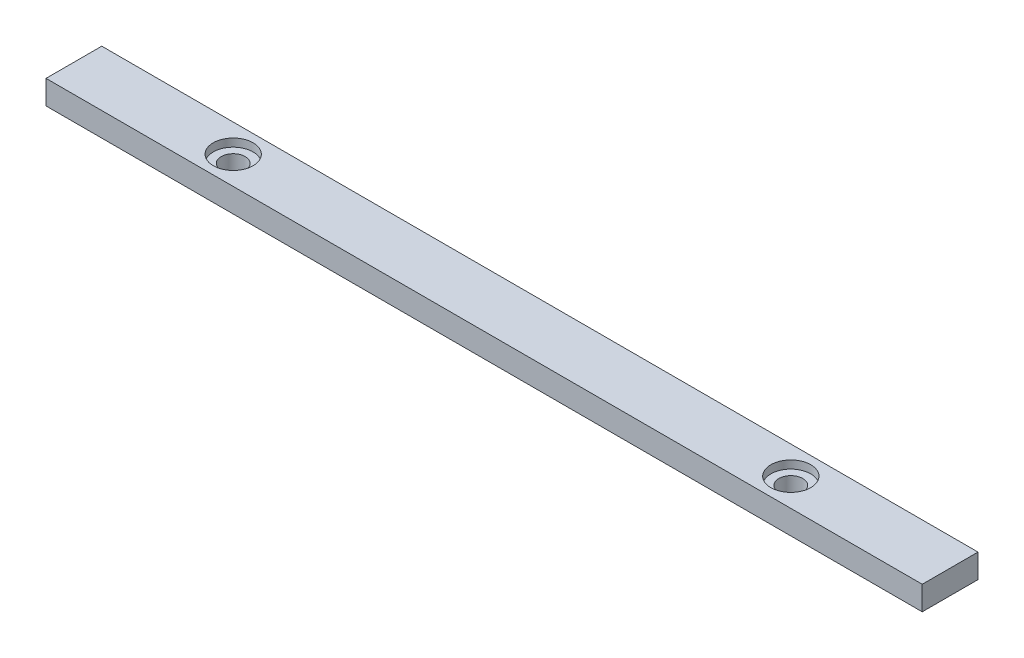
ISO-10303-21;
HEADER;
FILE_DESCRIPTION(('STEP AP214'),'2;1');
FILE_NAME('part.step','',(''),(''),'','','');
FILE_SCHEMA(('AUTOMOTIVE_DESIGN { 1 0 10303 214 1 1 1 1 }'));
ENDSEC;
DATA;
#1=APPLICATION_CONTEXT('core data for automotive mechanical design processes');
#2=APPLICATION_PROTOCOL_DEFINITION('international standard','automotive_design',2000,#1);
#3=PRODUCT_CONTEXT('',#1,'mechanical');
#4=PRODUCT('Part','Part','',(#3));
#5=PRODUCT_RELATED_PRODUCT_CATEGORY('part','',(#4));
#6=PRODUCT_DEFINITION_FORMATION('','',#4);
#7=PRODUCT_DEFINITION_CONTEXT('part definition',#1,'design');
#8=PRODUCT_DEFINITION('design','',#6,#7);
#9=PRODUCT_DEFINITION_SHAPE('','',#8);
#10=(LENGTH_UNIT() NAMED_UNIT(*) SI_UNIT(.MILLI.,.METRE.));
#11=(NAMED_UNIT(*) PLANE_ANGLE_UNIT() SI_UNIT($,.RADIAN.));
#12=(NAMED_UNIT(*) SI_UNIT($,.STERADIAN.) SOLID_ANGLE_UNIT());
#13=UNCERTAINTY_MEASURE_WITH_UNIT(LENGTH_MEASURE(1.E-05),#10,'distance_accuracy_value','');
#14=(GEOMETRIC_REPRESENTATION_CONTEXT(3) GLOBAL_UNCERTAINTY_ASSIGNED_CONTEXT((#13)) GLOBAL_UNIT_ASSIGNED_CONTEXT((#10,
#11,#12)) REPRESENTATION_CONTEXT('',''));
#15=CARTESIAN_POINT('',(0.,0.,0.));
#16=DIRECTION('',(0.,0.,1.));
#17=DIRECTION('',(1.,0.,0.));
#18=AXIS2_PLACEMENT_3D('',#15,#16,#17);
#19=CARTESIAN_POINT('',(20.,3.,-3.5));
#20=DIRECTION('',(0.,-1.,0.));
#21=DIRECTION('',(0.,0.,-1.));
#22=AXIS2_PLACEMENT_3D('',#19,#20,#21);
#23=CYLINDRICAL_SURFACE('',#22,1.5);
#24=CARTESIAN_POINT('',(20.,0.,-3.5));
#25=DIRECTION('',(0.,1.,0.));
#26=DIRECTION('',(0.,0.,1.));
#27=AXIS2_PLACEMENT_3D('',#24,#25,#26);
#28=CIRCLE('',#27,1.5);
#29=CARTESIAN_POINT('',(20.,0.,-2.));
#30=VERTEX_POINT('',#29);
#31=EDGE_CURVE('E103',#30,#30,#28,.T.);
#32=ORIENTED_EDGE('',*,*,#31,.F.);
#33=EDGE_LOOP('',(#32));
#34=FACE_BOUND('',#33,.T.);
#35=CARTESIAN_POINT('',(20.,2.,-3.5));
#36=DIRECTION('',(0.,1.,0.));
#37=DIRECTION('',(0.,0.,1.));
#38=AXIS2_PLACEMENT_3D('',#35,#36,#37);
#39=CIRCLE('',#38,1.5);
#40=CARTESIAN_POINT('',(20.,2.,-2.));
#41=VERTEX_POINT('',#40);
#42=EDGE_CURVE('E37',#41,#41,#39,.T.);
#43=ORIENTED_EDGE('',*,*,#42,.T.);
#44=EDGE_LOOP('',(#43));
#45=FACE_BOUND('',#44,.T.);
#46=ADVANCED_FACE('F33',(#34,#45),#23,.F.);
#47=CARTESIAN_POINT('',(90.,3.,-3.5));
#48=DIRECTION('',(0.,-1.,0.));
#49=DIRECTION('',(0.,0.,-1.));
#50=AXIS2_PLACEMENT_3D('',#47,#48,#49);
#51=CYLINDRICAL_SURFACE('',#50,1.5);
#52=CARTESIAN_POINT('',(90.,0.,-3.5));
#53=DIRECTION('',(0.,1.,0.));
#54=DIRECTION('',(0.,0.,1.));
#55=AXIS2_PLACEMENT_3D('',#52,#53,#54);
#56=CIRCLE('',#55,1.5);
#57=CARTESIAN_POINT('',(90.,0.,-2.));
#58=VERTEX_POINT('',#57);
#59=EDGE_CURVE('E114',#58,#58,#56,.T.);
#60=ORIENTED_EDGE('',*,*,#59,.F.);
#61=EDGE_LOOP('',(#60));
#62=FACE_BOUND('',#61,.T.);
#63=CARTESIAN_POINT('',(90.,2.,-3.5));
#64=DIRECTION('',(0.,1.,0.));
#65=DIRECTION('',(0.,0.,1.));
#66=AXIS2_PLACEMENT_3D('',#63,#64,#65);
#67=CIRCLE('',#66,1.5);
#68=CARTESIAN_POINT('',(90.,2.,-2.));
#69=VERTEX_POINT('',#68);
#70=EDGE_CURVE('E108',#69,#69,#67,.T.);
#71=ORIENTED_EDGE('',*,*,#70,.T.);
#72=EDGE_LOOP('',(#71));
#73=FACE_BOUND('',#72,.T.);
#74=ADVANCED_FACE('F139',(#62,#73),#51,.F.);
#75=CARTESIAN_POINT('',(0.,3.,0.));
#76=DIRECTION('',(0.,-1.,0.));
#77=DIRECTION('',(0.,0.,-1.));
#78=AXIS2_PLACEMENT_3D('',#75,#76,#77);
#79=PLANE('',#78);
#80=CARTESIAN_POINT('',(20.,3.,-3.5));
#81=DIRECTION('',(0.,1.,0.));
#82=DIRECTION('',(0.,0.,1.));
#83=AXIS2_PLACEMENT_3D('',#80,#81,#82);
#84=CIRCLE('',#83,2.5);
#85=CARTESIAN_POINT('',(20.,3.,-1.));
#86=VERTEX_POINT('',#85);
#87=EDGE_CURVE('E116',#86,#86,#84,.T.);
#88=ORIENTED_EDGE('',*,*,#87,.F.);
#89=EDGE_LOOP('',(#88));
#90=FACE_BOUND('',#89,.T.);
#91=CARTESIAN_POINT('',(90.,3.,-3.5));
#92=DIRECTION('',(0.,1.,0.));
#93=DIRECTION('',(0.,0.,1.));
#94=AXIS2_PLACEMENT_3D('',#91,#92,#93);
#95=CIRCLE('',#94,2.5);
#96=CARTESIAN_POINT('',(90.,3.,-1.));
#97=VERTEX_POINT('',#96);
#98=EDGE_CURVE('E126',#97,#97,#95,.T.);
#99=ORIENTED_EDGE('',*,*,#98,.F.);
#100=EDGE_LOOP('',(#99));
#101=FACE_BOUND('',#100,.T.);
#102=DIRECTION('',(0.,0.,1.));
#103=VECTOR('',#102,1.);
#104=CARTESIAN_POINT('',(0.,3.,0.));
#105=LINE('',#104,#103);
#106=CARTESIAN_POINT('',(0.,3.,-7.));
#107=VERTEX_POINT('',#106);
#108=CARTESIAN_POINT('',(0.,3.,0.));
#109=VERTEX_POINT('',#108);
#110=EDGE_CURVE('E87',#107,#109,#105,.T.);
#111=ORIENTED_EDGE('',*,*,#110,.T.);
#112=DIRECTION('',(1.,0.,0.));
#113=VECTOR('',#112,1.);
#114=CARTESIAN_POINT('',(0.,3.,0.));
#115=LINE('',#114,#113);
#116=CARTESIAN_POINT('',(110.,3.,0.));
#117=VERTEX_POINT('',#116);
#118=EDGE_CURVE('E82',#109,#117,#115,.T.);
#119=ORIENTED_EDGE('',*,*,#118,.T.);
#120=DIRECTION('',(0.,0.,-1.));
#121=VECTOR('',#120,1.);
#122=CARTESIAN_POINT('',(110.,3.,0.));
#123=LINE('',#122,#121);
#124=CARTESIAN_POINT('',(110.,3.,-7.));
#125=VERTEX_POINT('',#124);
#126=EDGE_CURVE('E85',#117,#125,#123,.T.);
#127=ORIENTED_EDGE('',*,*,#126,.T.);
#128=DIRECTION('',(-1.,0.,0.));
#129=VECTOR('',#128,1.);
#130=CARTESIAN_POINT('',(0.,3.,-7.));
#131=LINE('',#130,#129);
#132=EDGE_CURVE('E52',#125,#107,#131,.T.);
#133=ORIENTED_EDGE('',*,*,#132,.T.);
#134=EDGE_LOOP('',(#111,#119,#127,#133));
#135=FACE_BOUND('',#134,.T.);
#136=ADVANCED_FACE('F83',(#90,#101,#135),#79,.F.);
#137=CARTESIAN_POINT('',(0.,0.,0.));
#138=DIRECTION('',(0.,-1.,0.));
#139=DIRECTION('',(0.,0.,-1.));
#140=AXIS2_PLACEMENT_3D('',#137,#138,#139);
#141=PLANE('',#140);
#142=ORIENTED_EDGE('',*,*,#31,.T.);
#143=EDGE_LOOP('',(#142));
#144=FACE_BOUND('',#143,.T.);
#145=DIRECTION('',(0.,0.,1.));
#146=VECTOR('',#145,1.);
#147=CARTESIAN_POINT('',(0.,0.,0.));
#148=LINE('',#147,#146);
#149=CARTESIAN_POINT('',(0.,0.,-7.));
#150=VERTEX_POINT('',#149);
#151=CARTESIAN_POINT('',(0.,0.,0.));
#152=VERTEX_POINT('',#151);
#153=EDGE_CURVE('E100',#150,#152,#148,.T.);
#154=ORIENTED_EDGE('',*,*,#153,.F.);
#155=DIRECTION('',(-1.,0.,0.));
#156=VECTOR('',#155,1.);
#157=CARTESIAN_POINT('',(0.,0.,-7.));
#158=LINE('',#157,#156);
#159=CARTESIAN_POINT('',(110.,0.,-7.));
#160=VERTEX_POINT('',#159);
#161=EDGE_CURVE('E75',#160,#150,#158,.T.);
#162=ORIENTED_EDGE('',*,*,#161,.F.);
#163=DIRECTION('',(0.,0.,-1.));
#164=VECTOR('',#163,1.);
#165=CARTESIAN_POINT('',(110.,0.,0.));
#166=LINE('',#165,#164);
#167=CARTESIAN_POINT('',(110.,0.,0.));
#168=VERTEX_POINT('',#167);
#169=EDGE_CURVE('E69',#168,#160,#166,.T.);
#170=ORIENTED_EDGE('',*,*,#169,.F.);
#171=DIRECTION('',(1.,0.,0.));
#172=VECTOR('',#171,1.);
#173=CARTESIAN_POINT('',(0.,0.,0.));
#174=LINE('',#173,#172);
#175=EDGE_CURVE('E91',#152,#168,#174,.T.);
#176=ORIENTED_EDGE('',*,*,#175,.F.);
#177=EDGE_LOOP('',(#154,#162,#170,#176));
#178=FACE_BOUND('',#177,.T.);
#179=ORIENTED_EDGE('',*,*,#59,.T.);
#180=EDGE_LOOP('',(#179));
#181=FACE_BOUND('',#180,.T.);
#182=ADVANCED_FACE('F134',(#144,#178,#181),#141,.T.);
#183=CARTESIAN_POINT('',(0.,3.,0.));
#184=DIRECTION('',(1.,0.,0.));
#185=DIRECTION('',(0.,0.,-1.));
#186=AXIS2_PLACEMENT_3D('',#183,#184,#185);
#187=PLANE('',#186);
#188=ORIENTED_EDGE('',*,*,#153,.T.);
#189=DIRECTION('',(0.,-1.,0.));
#190=VECTOR('',#189,1.);
#191=CARTESIAN_POINT('',(0.,3.,0.));
#192=LINE('',#191,#190);
#193=EDGE_CURVE('E11',#109,#152,#192,.T.);
#194=ORIENTED_EDGE('',*,*,#193,.F.);
#195=ORIENTED_EDGE('',*,*,#110,.F.);
#196=DIRECTION('',(0.,-1.,0.));
#197=VECTOR('',#196,1.);
#198=CARTESIAN_POINT('',(0.,3.,-7.));
#199=LINE('',#198,#197);
#200=EDGE_CURVE('E96',#107,#150,#199,.T.);
#201=ORIENTED_EDGE('',*,*,#200,.T.);
#202=EDGE_LOOP('',(#188,#194,#195,#201));
#203=FACE_BOUND('',#202,.T.);
#204=ADVANCED_FACE('F35',(#203),#187,.F.);
#205=CARTESIAN_POINT('',(0.,3.,0.));
#206=DIRECTION('',(0.,0.,-1.));
#207=DIRECTION('',(-1.,0.,0.));
#208=AXIS2_PLACEMENT_3D('',#205,#206,#207);
#209=PLANE('',#208);
#210=ORIENTED_EDGE('',*,*,#175,.T.);
#211=DIRECTION('',(0.,-1.,0.));
#212=VECTOR('',#211,1.);
#213=CARTESIAN_POINT('',(110.,3.,0.));
#214=LINE('',#213,#212);
#215=EDGE_CURVE('E43',#117,#168,#214,.T.);
#216=ORIENTED_EDGE('',*,*,#215,.F.);
#217=ORIENTED_EDGE('',*,*,#118,.F.);
#218=ORIENTED_EDGE('',*,*,#193,.T.);
#219=EDGE_LOOP('',(#210,#216,#217,#218));
#220=FACE_BOUND('',#219,.T.);
#221=ADVANCED_FACE('F90',(#220),#209,.F.);
#222=CARTESIAN_POINT('',(110.,3.,0.));
#223=DIRECTION('',(-1.,0.,0.));
#224=DIRECTION('',(0.,0.,1.));
#225=AXIS2_PLACEMENT_3D('',#222,#223,#224);
#226=PLANE('',#225);
#227=ORIENTED_EDGE('',*,*,#169,.T.);
#228=DIRECTION('',(0.,-1.,0.));
#229=VECTOR('',#228,1.);
#230=CARTESIAN_POINT('',(110.,3.,-7.));
#231=LINE('',#230,#229);
#232=EDGE_CURVE('E92',#125,#160,#231,.T.);
#233=ORIENTED_EDGE('',*,*,#232,.F.);
#234=ORIENTED_EDGE('',*,*,#126,.F.);
#235=ORIENTED_EDGE('',*,*,#215,.T.);
#236=EDGE_LOOP('',(#227,#233,#234,#235));
#237=FACE_BOUND('',#236,.T.);
#238=ADVANCED_FACE('F94',(#237),#226,.F.);
#239=CARTESIAN_POINT('',(0.,3.,-7.));
#240=DIRECTION('',(0.,0.,1.));
#241=DIRECTION('',(1.,0.,0.));
#242=AXIS2_PLACEMENT_3D('',#239,#240,#241);
#243=PLANE('',#242);
#244=ORIENTED_EDGE('',*,*,#161,.T.);
#245=ORIENTED_EDGE('',*,*,#200,.F.);
#246=ORIENTED_EDGE('',*,*,#132,.F.);
#247=ORIENTED_EDGE('',*,*,#232,.T.);
#248=EDGE_LOOP('',(#244,#245,#246,#247));
#249=FACE_BOUND('',#248,.T.);
#250=ADVANCED_FACE('F160',(#249),#243,.F.);
#251=CARTESIAN_POINT('',(90.,2.,-3.5));
#252=DIRECTION('',(0.,1.,0.));
#253=DIRECTION('',(0.,0.,1.));
#254=AXIS2_PLACEMENT_3D('',#251,#252,#253);
#255=CYLINDRICAL_SURFACE('',#254,2.5);
#256=CARTESIAN_POINT('',(90.,2.,-3.5));
#257=DIRECTION('',(0.,1.,0.));
#258=DIRECTION('',(0.,0.,1.));
#259=AXIS2_PLACEMENT_3D('',#256,#257,#258);
#260=CIRCLE('',#259,2.5);
#261=CARTESIAN_POINT('',(90.,2.,-1.));
#262=VERTEX_POINT('',#261);
#263=EDGE_CURVE('E121',#262,#262,#260,.T.);
#264=ORIENTED_EDGE('',*,*,#263,.F.);
#265=EDGE_LOOP('',(#264));
#266=FACE_BOUND('',#265,.T.);
#267=ORIENTED_EDGE('',*,*,#98,.T.);
#268=EDGE_LOOP('',(#267));
#269=FACE_BOUND('',#268,.T.);
#270=ADVANCED_FACE('F156',(#266,#269),#255,.F.);
#271=CARTESIAN_POINT('',(90.,2.,-3.5));
#272=DIRECTION('',(0.,1.,0.));
#273=DIRECTION('',(0.,0.,1.));
#274=AXIS2_PLACEMENT_3D('',#271,#272,#273);
#275=PLANE('',#274);
#276=ORIENTED_EDGE('',*,*,#70,.F.);
#277=EDGE_LOOP('',(#276));
#278=FACE_BOUND('',#277,.T.);
#279=ORIENTED_EDGE('',*,*,#263,.T.);
#280=EDGE_LOOP('',(#279));
#281=FACE_BOUND('',#280,.T.);
#282=ADVANCED_FACE('F150',(#278,#281),#275,.T.);
#283=CARTESIAN_POINT('',(20.,2.,-3.5));
#284=DIRECTION('',(0.,1.,0.));
#285=DIRECTION('',(0.,0.,1.));
#286=AXIS2_PLACEMENT_3D('',#283,#284,#285);
#287=CYLINDRICAL_SURFACE('',#286,2.5);
#288=CARTESIAN_POINT('',(20.,2.,-3.5));
#289=DIRECTION('',(0.,1.,0.));
#290=DIRECTION('',(0.,0.,1.));
#291=AXIS2_PLACEMENT_3D('',#288,#289,#290);
#292=CIRCLE('',#291,2.5);
#293=CARTESIAN_POINT('',(20.,2.,-1.));
#294=VERTEX_POINT('',#293);
#295=EDGE_CURVE('E110',#294,#294,#292,.T.);
#296=ORIENTED_EDGE('',*,*,#295,.F.);
#297=EDGE_LOOP('',(#296));
#298=FACE_BOUND('',#297,.T.);
#299=ORIENTED_EDGE('',*,*,#87,.T.);
#300=EDGE_LOOP('',(#299));
#301=FACE_BOUND('',#300,.T.);
#302=ADVANCED_FACE('F145',(#298,#301),#287,.F.);
#303=CARTESIAN_POINT('',(20.,2.,-3.5));
#304=DIRECTION('',(0.,1.,0.));
#305=DIRECTION('',(0.,0.,1.));
#306=AXIS2_PLACEMENT_3D('',#303,#304,#305);
#307=PLANE('',#306);
#308=ORIENTED_EDGE('',*,*,#42,.F.);
#309=EDGE_LOOP('',(#308));
#310=FACE_BOUND('',#309,.T.);
#311=ORIENTED_EDGE('',*,*,#295,.T.);
#312=EDGE_LOOP('',(#311));
#313=FACE_BOUND('',#312,.T.);
#314=ADVANCED_FACE('F143',(#310,#313),#307,.T.);
#315=CLOSED_SHELL('',(#46,#74,#136,#182,#204,#221,#238,#250,#270,#282,#302,#314));
#316=MANIFOLD_SOLID_BREP('B2',#315);
#317=ADVANCED_BREP_SHAPE_REPRESENTATION('',(#18,#316),#14);
#318=SHAPE_DEFINITION_REPRESENTATION(#9,#317);
ENDSEC;
END-ISO-10303-21;
